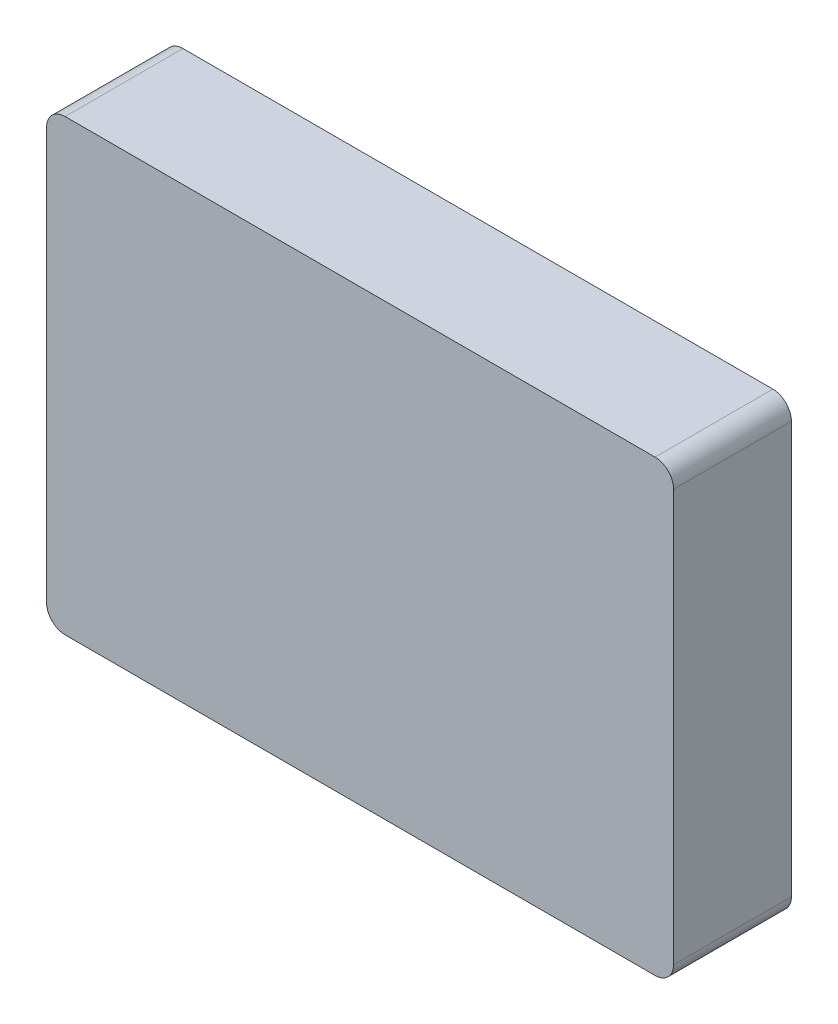
ISO-10303-21;
HEADER;
FILE_DESCRIPTION(('STEP AP214'),'2;1');
FILE_NAME('part.step','',(''),(''),'','','');
FILE_SCHEMA(('AUTOMOTIVE_DESIGN { 1 0 10303 214 1 1 1 1 }'));
ENDSEC;
DATA;
#1=APPLICATION_CONTEXT('core data for automotive mechanical design processes');
#2=APPLICATION_PROTOCOL_DEFINITION('international standard','automotive_design',2000,#1);
#3=PRODUCT_CONTEXT('',#1,'mechanical');
#4=PRODUCT('Part','Part','',(#3));
#5=PRODUCT_RELATED_PRODUCT_CATEGORY('part','',(#4));
#6=PRODUCT_DEFINITION_FORMATION('','',#4);
#7=PRODUCT_DEFINITION_CONTEXT('part definition',#1,'design');
#8=PRODUCT_DEFINITION('design','',#6,#7);
#9=PRODUCT_DEFINITION_SHAPE('','',#8);
#10=(LENGTH_UNIT() NAMED_UNIT(*) SI_UNIT(.MILLI.,.METRE.));
#11=(NAMED_UNIT(*) PLANE_ANGLE_UNIT() SI_UNIT($,.RADIAN.));
#12=(NAMED_UNIT(*) SI_UNIT($,.STERADIAN.) SOLID_ANGLE_UNIT());
#13=UNCERTAINTY_MEASURE_WITH_UNIT(LENGTH_MEASURE(1.E-05),#10,'distance_accuracy_value','');
#14=(GEOMETRIC_REPRESENTATION_CONTEXT(3) GLOBAL_UNCERTAINTY_ASSIGNED_CONTEXT((#13)) GLOBAL_UNIT_ASSIGNED_CONTEXT((#10,
#11,#12)) REPRESENTATION_CONTEXT('',''));
#15=CARTESIAN_POINT('',(0.,0.,0.));
#16=DIRECTION('',(0.,0.,1.));
#17=DIRECTION('',(1.,0.,0.));
#18=AXIS2_PLACEMENT_3D('',#15,#16,#17);
#19=CARTESIAN_POINT('',(-8.45,-6.05,3.175));
#20=DIRECTION('',(1.,0.,0.));
#21=DIRECTION('',(0.,0.,-1.));
#22=AXIS2_PLACEMENT_3D('',#19,#20,#21);
#23=PLANE('',#22);
#24=DIRECTION('',(0.,-1.,0.));
#25=VECTOR('',#24,1.);
#26=CARTESIAN_POINT('',(-8.45,-6.05,0.));
#27=LINE('',#26,#25);
#28=CARTESIAN_POINT('',(-8.45,5.55,0.));
#29=VERTEX_POINT('',#28);
#30=CARTESIAN_POINT('',(-8.45,-5.55,0.));
#31=VERTEX_POINT('',#30);
#32=EDGE_CURVE('E161',#29,#31,#27,.T.);
#33=ORIENTED_EDGE('',*,*,#32,.T.);
#34=DIRECTION('',(0.,0.,-1.));
#35=VECTOR('',#34,1.);
#36=CARTESIAN_POINT('',(-8.45,-5.55,3.175));
#37=LINE('',#36,#35);
#38=CARTESIAN_POINT('',(-8.45,-5.55,3.175));
#39=VERTEX_POINT('',#38);
#40=EDGE_CURVE('E11',#31,#39,#37,.F.);
#41=ORIENTED_EDGE('',*,*,#40,.T.);
#42=DIRECTION('',(0.,-1.,0.));
#43=VECTOR('',#42,1.);
#44=CARTESIAN_POINT('',(-8.45,-6.05,3.175));
#45=LINE('',#44,#43);
#46=CARTESIAN_POINT('',(-8.45,5.55,3.175));
#47=VERTEX_POINT('',#46);
#48=EDGE_CURVE('E129',#47,#39,#45,.T.);
#49=ORIENTED_EDGE('',*,*,#48,.F.);
#50=DIRECTION('',(0.,0.,-1.));
#51=VECTOR('',#50,1.);
#52=CARTESIAN_POINT('',(-8.45,5.55,3.175));
#53=LINE('',#52,#51);
#54=EDGE_CURVE('E45',#47,#29,#53,.T.);
#55=ORIENTED_EDGE('',*,*,#54,.T.);
#56=EDGE_LOOP('',(#33,#41,#49,#55));
#57=FACE_BOUND('',#56,.T.);
#58=ADVANCED_FACE('F37',(#57),#23,.F.);
#59=CARTESIAN_POINT('',(8.45,-6.05,3.175));
#60=DIRECTION('',(0.,1.,0.));
#61=DIRECTION('',(-1.,0.,0.));
#62=AXIS2_PLACEMENT_3D('',#59,#60,#61);
#63=PLANE('',#62);
#64=DIRECTION('',(1.,0.,0.));
#65=VECTOR('',#64,1.);
#66=CARTESIAN_POINT('',(8.45,-6.05,0.));
#67=LINE('',#66,#65);
#68=CARTESIAN_POINT('',(-7.95,-6.05,0.));
#69=VERTEX_POINT('',#68);
#70=CARTESIAN_POINT('',(7.95,-6.05,0.));
#71=VERTEX_POINT('',#70);
#72=EDGE_CURVE('E134',#69,#71,#67,.T.);
#73=ORIENTED_EDGE('',*,*,#72,.T.);
#74=DIRECTION('',(0.,0.,-1.));
#75=VECTOR('',#74,1.);
#76=CARTESIAN_POINT('',(7.95,-6.05,3.175));
#77=LINE('',#76,#75);
#78=CARTESIAN_POINT('',(7.95,-6.05,3.175));
#79=VERTEX_POINT('',#78);
#80=EDGE_CURVE('E52',#71,#79,#77,.F.);
#81=ORIENTED_EDGE('',*,*,#80,.T.);
#82=DIRECTION('',(1.,0.,0.));
#83=VECTOR('',#82,1.);
#84=CARTESIAN_POINT('',(8.45,-6.05,3.175));
#85=LINE('',#84,#83);
#86=CARTESIAN_POINT('',(-7.95,-6.05,3.175));
#87=VERTEX_POINT('',#86);
#88=EDGE_CURVE('E132',#87,#79,#85,.T.);
#89=ORIENTED_EDGE('',*,*,#88,.F.);
#90=DIRECTION('',(0.,0.,-1.));
#91=VECTOR('',#90,1.);
#92=CARTESIAN_POINT('',(-7.95,-6.05,3.175));
#93=LINE('',#92,#91);
#94=EDGE_CURVE('E153',#87,#69,#93,.T.);
#95=ORIENTED_EDGE('',*,*,#94,.T.);
#96=EDGE_LOOP('',(#73,#81,#89,#95));
#97=FACE_BOUND('',#96,.T.);
#98=ADVANCED_FACE('F181',(#97),#63,.F.);
#99=CARTESIAN_POINT('',(8.45,-6.05,3.175));
#100=DIRECTION('',(-1.,0.,0.));
#101=DIRECTION('',(0.,0.,1.));
#102=AXIS2_PLACEMENT_3D('',#99,#100,#101);
#103=PLANE('',#102);
#104=DIRECTION('',(0.,1.,0.));
#105=VECTOR('',#104,1.);
#106=CARTESIAN_POINT('',(8.45,-6.05,0.));
#107=LINE('',#106,#105);
#108=CARTESIAN_POINT('',(8.45,-5.55,0.));
#109=VERTEX_POINT('',#108);
#110=CARTESIAN_POINT('',(8.45,5.55,0.));
#111=VERTEX_POINT('',#110);
#112=EDGE_CURVE('E130',#109,#111,#107,.T.);
#113=ORIENTED_EDGE('',*,*,#112,.T.);
#114=DIRECTION('',(0.,0.,-1.));
#115=VECTOR('',#114,1.);
#116=CARTESIAN_POINT('',(8.45,5.55,3.175));
#117=LINE('',#116,#115);
#118=CARTESIAN_POINT('',(8.45,5.55,3.175));
#119=VERTEX_POINT('',#118);
#120=EDGE_CURVE('E108',#111,#119,#117,.F.);
#121=ORIENTED_EDGE('',*,*,#120,.T.);
#122=DIRECTION('',(0.,1.,0.));
#123=VECTOR('',#122,1.);
#124=CARTESIAN_POINT('',(8.45,-6.05,3.175));
#125=LINE('',#124,#123);
#126=CARTESIAN_POINT('',(8.45,-5.55,3.175));
#127=VERTEX_POINT('',#126);
#128=EDGE_CURVE('E169',#127,#119,#125,.T.);
#129=ORIENTED_EDGE('',*,*,#128,.F.);
#130=DIRECTION('',(0.,0.,-1.));
#131=VECTOR('',#130,1.);
#132=CARTESIAN_POINT('',(8.45,-5.55,3.175));
#133=LINE('',#132,#131);
#134=EDGE_CURVE('E113',#127,#109,#133,.T.);
#135=ORIENTED_EDGE('',*,*,#134,.T.);
#136=EDGE_LOOP('',(#113,#121,#129,#135));
#137=FACE_BOUND('',#136,.T.);
#138=ADVANCED_FACE('F180',(#137),#103,.F.);
#139=CARTESIAN_POINT('',(8.45,6.05,3.175));
#140=DIRECTION('',(0.,-1.,0.));
#141=DIRECTION('',(1.,0.,0.));
#142=AXIS2_PLACEMENT_3D('',#139,#140,#141);
#143=PLANE('',#142);
#144=DIRECTION('',(-1.,0.,0.));
#145=VECTOR('',#144,1.);
#146=CARTESIAN_POINT('',(8.45,6.05,3.175));
#147=LINE('',#146,#145);
#148=CARTESIAN_POINT('',(7.95,6.05,3.175));
#149=VERTEX_POINT('',#148);
#150=CARTESIAN_POINT('',(-7.95,6.05,3.175));
#151=VERTEX_POINT('',#150);
#152=EDGE_CURVE('E123',#149,#151,#147,.T.);
#153=ORIENTED_EDGE('',*,*,#152,.F.);
#154=DIRECTION('',(0.,0.,-1.));
#155=VECTOR('',#154,1.);
#156=CARTESIAN_POINT('',(7.95,6.05,3.175));
#157=LINE('',#156,#155);
#158=CARTESIAN_POINT('',(7.95,6.05,0.));
#159=VERTEX_POINT('',#158);
#160=EDGE_CURVE('E107',#149,#159,#157,.T.);
#161=ORIENTED_EDGE('',*,*,#160,.T.);
#162=DIRECTION('',(-1.,0.,0.));
#163=VECTOR('',#162,1.);
#164=CARTESIAN_POINT('',(8.45,6.05,0.));
#165=LINE('',#164,#163);
#166=CARTESIAN_POINT('',(-7.95,6.05,0.));
#167=VERTEX_POINT('',#166);
#168=EDGE_CURVE('E120',#159,#167,#165,.T.);
#169=ORIENTED_EDGE('',*,*,#168,.T.);
#170=DIRECTION('',(0.,0.,-1.));
#171=VECTOR('',#170,1.);
#172=CARTESIAN_POINT('',(-7.95,6.05,3.175));
#173=LINE('',#172,#171);
#174=EDGE_CURVE('E125',#167,#151,#173,.F.);
#175=ORIENTED_EDGE('',*,*,#174,.T.);
#176=EDGE_LOOP('',(#153,#161,#169,#175));
#177=FACE_BOUND('',#176,.T.);
#178=ADVANCED_FACE('F119',(#177),#143,.F.);
#179=CARTESIAN_POINT('',(0.,0.,3.175));
#180=DIRECTION('',(0.,0.,1.));
#181=DIRECTION('',(1.,0.,0.));
#182=AXIS2_PLACEMENT_3D('',#179,#180,#181);
#183=PLANE('',#182);
#184=ORIENTED_EDGE('',*,*,#128,.T.);
#185=CARTESIAN_POINT('',(7.95,5.55,3.175));
#186=DIRECTION('',(0.,0.,1.));
#187=DIRECTION('',(1.,0.,0.));
#188=AXIS2_PLACEMENT_3D('',#185,#186,#187);
#189=CIRCLE('',#188,0.5);
#190=EDGE_CURVE('E151',#119,#149,#189,.T.);
#191=ORIENTED_EDGE('',*,*,#190,.T.);
#192=ORIENTED_EDGE('',*,*,#152,.T.);
#193=CARTESIAN_POINT('',(-7.95,5.55,3.175));
#194=DIRECTION('',(0.,0.,1.));
#195=DIRECTION('',(1.,0.,0.));
#196=AXIS2_PLACEMENT_3D('',#193,#194,#195);
#197=CIRCLE('',#196,0.5);
#198=EDGE_CURVE('E146',#151,#47,#197,.T.);
#199=ORIENTED_EDGE('',*,*,#198,.T.);
#200=ORIENTED_EDGE('',*,*,#48,.T.);
#201=CARTESIAN_POINT('',(-7.95,-5.55,3.175));
#202=DIRECTION('',(0.,0.,1.));
#203=DIRECTION('',(1.,0.,0.));
#204=AXIS2_PLACEMENT_3D('',#201,#202,#203);
#205=CIRCLE('',#204,0.5);
#206=EDGE_CURVE('E59',#39,#87,#205,.T.);
#207=ORIENTED_EDGE('',*,*,#206,.T.);
#208=ORIENTED_EDGE('',*,*,#88,.T.);
#209=CARTESIAN_POINT('',(7.95,-5.55,3.175));
#210=DIRECTION('',(0.,0.,1.));
#211=DIRECTION('',(1.,0.,0.));
#212=AXIS2_PLACEMENT_3D('',#209,#210,#211);
#213=CIRCLE('',#212,0.5);
#214=EDGE_CURVE('E149',#79,#127,#213,.T.);
#215=ORIENTED_EDGE('',*,*,#214,.T.);
#216=EDGE_LOOP('',(#184,#191,#192,#199,#200,#207,#208,#215));
#217=FACE_BOUND('',#216,.T.);
#218=ADVANCED_FACE('F173',(#217),#183,.T.);
#219=CARTESIAN_POINT('',(0.,0.,0.));
#220=DIRECTION('',(0.,0.,1.));
#221=DIRECTION('',(1.,0.,0.));
#222=AXIS2_PLACEMENT_3D('',#219,#220,#221);
#223=PLANE('',#222);
#224=ORIENTED_EDGE('',*,*,#168,.F.);
#225=CARTESIAN_POINT('',(7.95,5.55,0.));
#226=DIRECTION('',(0.,0.,1.));
#227=DIRECTION('',(1.,0.,0.));
#228=AXIS2_PLACEMENT_3D('',#225,#226,#227);
#229=CIRCLE('',#228,0.5);
#230=EDGE_CURVE('E103',#159,#111,#229,.F.);
#231=ORIENTED_EDGE('',*,*,#230,.T.);
#232=ORIENTED_EDGE('',*,*,#112,.F.);
#233=CARTESIAN_POINT('',(7.95,-5.55,0.));
#234=DIRECTION('',(0.,0.,1.));
#235=DIRECTION('',(1.,0.,0.));
#236=AXIS2_PLACEMENT_3D('',#233,#234,#235);
#237=CIRCLE('',#236,0.5);
#238=EDGE_CURVE('E114',#109,#71,#237,.F.);
#239=ORIENTED_EDGE('',*,*,#238,.T.);
#240=ORIENTED_EDGE('',*,*,#72,.F.);
#241=CARTESIAN_POINT('',(-7.95,-5.55,0.));
#242=DIRECTION('',(0.,0.,1.));
#243=DIRECTION('',(1.,0.,0.));
#244=AXIS2_PLACEMENT_3D('',#241,#242,#243);
#245=CIRCLE('',#244,0.5);
#246=EDGE_CURVE('E140',#69,#31,#245,.F.);
#247=ORIENTED_EDGE('',*,*,#246,.T.);
#248=ORIENTED_EDGE('',*,*,#32,.F.);
#249=CARTESIAN_POINT('',(-7.95,5.55,0.));
#250=DIRECTION('',(0.,0.,1.));
#251=DIRECTION('',(1.,0.,0.));
#252=AXIS2_PLACEMENT_3D('',#249,#250,#251);
#253=CIRCLE('',#252,0.5);
#254=EDGE_CURVE('E124',#29,#167,#253,.F.);
#255=ORIENTED_EDGE('',*,*,#254,.T.);
#256=EDGE_LOOP('',(#224,#231,#232,#239,#240,#247,#248,#255));
#257=FACE_BOUND('',#256,.T.);
#258=ADVANCED_FACE('F127',(#257),#223,.F.);
#259=CARTESIAN_POINT('',(7.95,5.55,3.175));
#260=DIRECTION('',(0.,0.,-1.));
#261=DIRECTION('',(-1.,0.,0.));
#262=AXIS2_PLACEMENT_3D('',#259,#260,#261);
#263=CYLINDRICAL_SURFACE('',#262,0.5);
#264=ORIENTED_EDGE('',*,*,#190,.F.);
#265=ORIENTED_EDGE('',*,*,#120,.F.);
#266=ORIENTED_EDGE('',*,*,#230,.F.);
#267=ORIENTED_EDGE('',*,*,#160,.F.);
#268=EDGE_LOOP('',(#264,#265,#266,#267));
#269=FACE_BOUND('',#268,.T.);
#270=ADVANCED_FACE('F106',(#269),#263,.T.);
#271=CARTESIAN_POINT('',(7.95,-5.55,3.175));
#272=DIRECTION('',(0.,0.,-1.));
#273=DIRECTION('',(-1.,0.,0.));
#274=AXIS2_PLACEMENT_3D('',#271,#272,#273);
#275=CYLINDRICAL_SURFACE('',#274,0.5);
#276=ORIENTED_EDGE('',*,*,#214,.F.);
#277=ORIENTED_EDGE('',*,*,#80,.F.);
#278=ORIENTED_EDGE('',*,*,#238,.F.);
#279=ORIENTED_EDGE('',*,*,#134,.F.);
#280=EDGE_LOOP('',(#276,#277,#278,#279));
#281=FACE_BOUND('',#280,.T.);
#282=ADVANCED_FACE('F178',(#281),#275,.T.);
#283=CARTESIAN_POINT('',(-7.95,-5.55,3.175));
#284=DIRECTION('',(0.,0.,-1.));
#285=DIRECTION('',(-1.,0.,0.));
#286=AXIS2_PLACEMENT_3D('',#283,#284,#285);
#287=CYLINDRICAL_SURFACE('',#286,0.5);
#288=ORIENTED_EDGE('',*,*,#206,.F.);
#289=ORIENTED_EDGE('',*,*,#40,.F.);
#290=ORIENTED_EDGE('',*,*,#246,.F.);
#291=ORIENTED_EDGE('',*,*,#94,.F.);
#292=EDGE_LOOP('',(#288,#289,#290,#291));
#293=FACE_BOUND('',#292,.T.);
#294=ADVANCED_FACE('F183',(#293),#287,.T.);
#295=CARTESIAN_POINT('',(-7.95,5.55,3.175));
#296=DIRECTION('',(0.,0.,-1.));
#297=DIRECTION('',(-1.,0.,0.));
#298=AXIS2_PLACEMENT_3D('',#295,#296,#297);
#299=CYLINDRICAL_SURFACE('',#298,0.5);
#300=ORIENTED_EDGE('',*,*,#198,.F.);
#301=ORIENTED_EDGE('',*,*,#174,.F.);
#302=ORIENTED_EDGE('',*,*,#254,.F.);
#303=ORIENTED_EDGE('',*,*,#54,.F.);
#304=EDGE_LOOP('',(#300,#301,#302,#303));
#305=FACE_BOUND('',#304,.T.);
#306=ADVANCED_FACE('F39',(#305),#299,.T.);
#307=CLOSED_SHELL('',(#58,#98,#138,#178,#218,#258,#270,#282,#294,#306));
#308=MANIFOLD_SOLID_BREP('B2',#307);
#309=ADVANCED_BREP_SHAPE_REPRESENTATION('',(#18,#308),#14);
#310=SHAPE_DEFINITION_REPRESENTATION(#9,#309);
ENDSEC;
END-ISO-10303-21;
